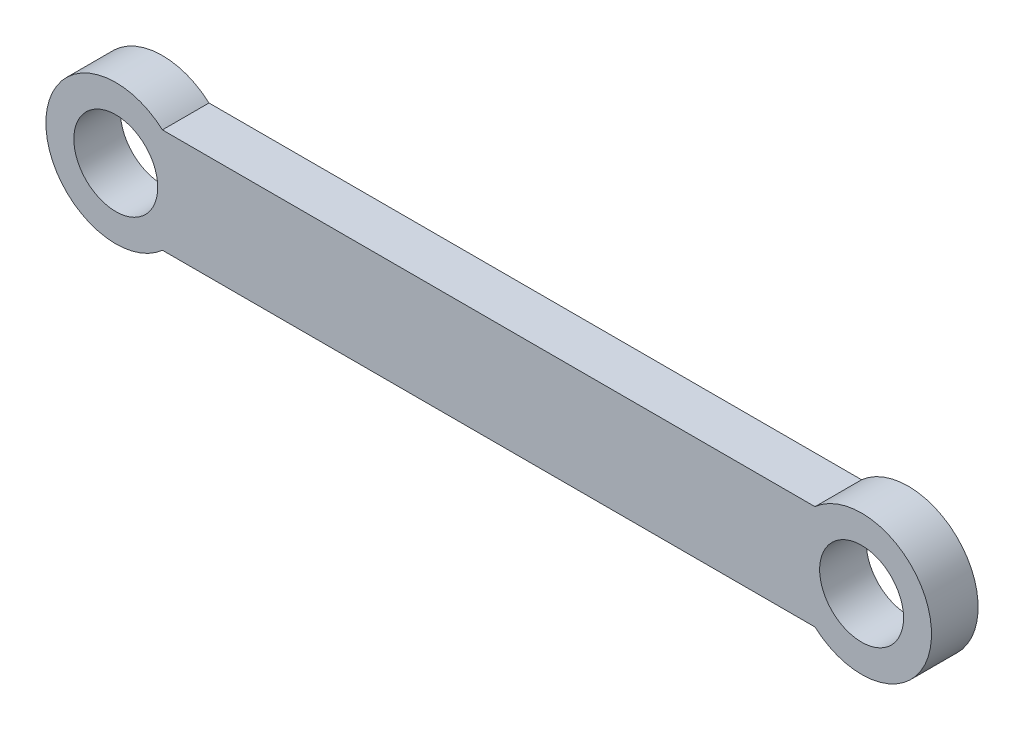
ISO-10303-21;
HEADER;
FILE_DESCRIPTION(('STEP AP214'),'2;1');
FILE_NAME('part.step','',(''),(''),'','','');
FILE_SCHEMA(('AUTOMOTIVE_DESIGN { 1 0 10303 214 1 1 1 1 }'));
ENDSEC;
DATA;
#1=APPLICATION_CONTEXT('core data for automotive mechanical design processes');
#2=APPLICATION_PROTOCOL_DEFINITION('international standard','automotive_design',2000,#1);
#3=PRODUCT_CONTEXT('',#1,'mechanical');
#4=PRODUCT('Part','Part','',(#3));
#5=PRODUCT_RELATED_PRODUCT_CATEGORY('part','',(#4));
#6=PRODUCT_DEFINITION_FORMATION('','',#4);
#7=PRODUCT_DEFINITION_CONTEXT('part definition',#1,'design');
#8=PRODUCT_DEFINITION('design','',#6,#7);
#9=PRODUCT_DEFINITION_SHAPE('','',#8);
#10=(LENGTH_UNIT() NAMED_UNIT(*) SI_UNIT(.MILLI.,.METRE.));
#11=(NAMED_UNIT(*) PLANE_ANGLE_UNIT() SI_UNIT($,.RADIAN.));
#12=(NAMED_UNIT(*) SI_UNIT($,.STERADIAN.) SOLID_ANGLE_UNIT());
#13=UNCERTAINTY_MEASURE_WITH_UNIT(LENGTH_MEASURE(1.E-05),#10,'distance_accuracy_value','');
#14=(GEOMETRIC_REPRESENTATION_CONTEXT(3) GLOBAL_UNCERTAINTY_ASSIGNED_CONTEXT((#13)) GLOBAL_UNIT_ASSIGNED_CONTEXT((#10,
#11,#12)) REPRESENTATION_CONTEXT('',''));
#15=CARTESIAN_POINT('',(0.,0.,0.));
#16=DIRECTION('',(0.,0.,1.));
#17=DIRECTION('',(1.,0.,0.));
#18=AXIS2_PLACEMENT_3D('',#15,#16,#17);
#19=CARTESIAN_POINT('',(0.,0.,5.));
#20=DIRECTION('',(0.,0.,1.));
#21=DIRECTION('',(1.,0.,0.));
#22=AXIS2_PLACEMENT_3D('',#19,#20,#21);
#23=PLANE('',#22);
#24=CARTESIAN_POINT('',(0.,0.,5.));
#25=DIRECTION('',(0.,0.,1.));
#26=DIRECTION('',(1.,0.,0.));
#27=AXIS2_PLACEMENT_3D('',#24,#25,#26);
#28=CIRCLE('',#27,4.5);
#29=CARTESIAN_POINT('',(4.5,0.,5.));
#30=VERTEX_POINT('',#29);
#31=EDGE_CURVE('E100',#30,#30,#28,.T.);
#32=ORIENTED_EDGE('',*,*,#31,.F.);
#33=EDGE_LOOP('',(#32));
#34=FACE_BOUND('',#33,.T.);
#35=CARTESIAN_POINT('',(0.,0.,5.));
#36=DIRECTION('',(0.,0.,1.));
#37=DIRECTION('',(1.,0.,0.));
#38=AXIS2_PLACEMENT_3D('',#35,#36,#37);
#39=CIRCLE('',#38,7.5);
#40=CARTESIAN_POINT('',(5.,5.59016994374947,5.));
#41=VERTEX_POINT('',#40);
#42=CARTESIAN_POINT('',(5.,-5.59016994374947,5.));
#43=VERTEX_POINT('',#42);
#44=EDGE_CURVE('E85',#41,#43,#39,.T.);
#45=ORIENTED_EDGE('',*,*,#44,.T.);
#46=DIRECTION('',(1.,0.,0.));
#47=VECTOR('',#46,1.);
#48=CARTESIAN_POINT('',(5.,-5.59016994374947,5.));
#49=LINE('',#48,#47);
#50=CARTESIAN_POINT('',(75.,-5.59016994374947,5.));
#51=VERTEX_POINT('',#50);
#52=EDGE_CURVE('E80',#43,#51,#49,.T.);
#53=ORIENTED_EDGE('',*,*,#52,.T.);
#54=CARTESIAN_POINT('',(80.,0.,5.));
#55=DIRECTION('',(0.,0.,1.));
#56=DIRECTION('',(1.,0.,0.));
#57=AXIS2_PLACEMENT_3D('',#54,#55,#56);
#58=CIRCLE('',#57,7.5);
#59=CARTESIAN_POINT('',(75.,5.59016994374947,5.));
#60=VERTEX_POINT('',#59);
#61=EDGE_CURVE('E83',#51,#60,#58,.T.);
#62=ORIENTED_EDGE('',*,*,#61,.T.);
#63=DIRECTION('',(-1.,0.,0.));
#64=VECTOR('',#63,1.);
#65=CARTESIAN_POINT('',(5.,5.59016994374947,5.));
#66=LINE('',#65,#64);
#67=EDGE_CURVE('E50',#60,#41,#66,.T.);
#68=ORIENTED_EDGE('',*,*,#67,.T.);
#69=EDGE_LOOP('',(#45,#53,#62,#68));
#70=FACE_BOUND('',#69,.T.);
#71=CARTESIAN_POINT('',(80.,0.,5.));
#72=DIRECTION('',(0.,0.,1.));
#73=DIRECTION('',(1.,0.,0.));
#74=AXIS2_PLACEMENT_3D('',#71,#72,#73);
#75=CIRCLE('',#74,4.5);
#76=CARTESIAN_POINT('',(84.5,0.,5.));
#77=VERTEX_POINT('',#76);
#78=EDGE_CURVE('E115',#77,#77,#75,.T.);
#79=ORIENTED_EDGE('',*,*,#78,.F.);
#80=EDGE_LOOP('',(#79));
#81=FACE_BOUND('',#80,.T.);
#82=ADVANCED_FACE('F33',(#34,#70,#81),#23,.T.);
#83=CARTESIAN_POINT('',(0.,0.,0.));
#84=DIRECTION('',(0.,0.,1.));
#85=DIRECTION('',(1.,0.,0.));
#86=AXIS2_PLACEMENT_3D('',#83,#84,#85);
#87=PLANE('',#86);
#88=CARTESIAN_POINT('',(0.,0.,0.));
#89=DIRECTION('',(0.,0.,1.));
#90=DIRECTION('',(1.,0.,0.));
#91=AXIS2_PLACEMENT_3D('',#88,#89,#90);
#92=CIRCLE('',#91,7.5);
#93=CARTESIAN_POINT('',(5.,5.59016994374947,0.));
#94=VERTEX_POINT('',#93);
#95=CARTESIAN_POINT('',(5.,-5.59016994374947,0.));
#96=VERTEX_POINT('',#95);
#97=EDGE_CURVE('E97',#94,#96,#92,.T.);
#98=ORIENTED_EDGE('',*,*,#97,.F.);
#99=DIRECTION('',(-1.,0.,0.));
#100=VECTOR('',#99,1.);
#101=CARTESIAN_POINT('',(5.,5.59016994374947,0.));
#102=LINE('',#101,#100);
#103=CARTESIAN_POINT('',(75.,5.59016994374947,0.));
#104=VERTEX_POINT('',#103);
#105=EDGE_CURVE('E73',#104,#94,#102,.T.);
#106=ORIENTED_EDGE('',*,*,#105,.F.);
#107=CARTESIAN_POINT('',(80.,0.,0.));
#108=DIRECTION('',(0.,0.,1.));
#109=DIRECTION('',(1.,0.,0.));
#110=AXIS2_PLACEMENT_3D('',#107,#108,#109);
#111=CIRCLE('',#110,7.5);
#112=CARTESIAN_POINT('',(75.,-5.59016994374947,0.));
#113=VERTEX_POINT('',#112);
#114=EDGE_CURVE('E67',#113,#104,#111,.T.);
#115=ORIENTED_EDGE('',*,*,#114,.F.);
#116=DIRECTION('',(1.,0.,0.));
#117=VECTOR('',#116,1.);
#118=CARTESIAN_POINT('',(5.,-5.59016994374947,0.));
#119=LINE('',#118,#117);
#120=EDGE_CURVE('E89',#96,#113,#119,.T.);
#121=ORIENTED_EDGE('',*,*,#120,.F.);
#122=EDGE_LOOP('',(#98,#106,#115,#121));
#123=FACE_BOUND('',#122,.T.);
#124=CARTESIAN_POINT('',(0.,0.,0.));
#125=DIRECTION('',(0.,0.,1.));
#126=DIRECTION('',(1.,0.,0.));
#127=AXIS2_PLACEMENT_3D('',#124,#125,#126);
#128=CIRCLE('',#127,4.5);
#129=CARTESIAN_POINT('',(4.5,0.,0.));
#130=VERTEX_POINT('',#129);
#131=EDGE_CURVE('E112',#130,#130,#128,.T.);
#132=ORIENTED_EDGE('',*,*,#131,.T.);
#133=EDGE_LOOP('',(#132));
#134=FACE_BOUND('',#133,.T.);
#135=CARTESIAN_POINT('',(80.,0.,0.));
#136=DIRECTION('',(0.,0.,1.));
#137=DIRECTION('',(1.,0.,0.));
#138=AXIS2_PLACEMENT_3D('',#135,#136,#137);
#139=CIRCLE('',#138,4.5);
#140=CARTESIAN_POINT('',(84.5,0.,0.));
#141=VERTEX_POINT('',#140);
#142=EDGE_CURVE('E118',#141,#141,#139,.T.);
#143=ORIENTED_EDGE('',*,*,#142,.T.);
#144=EDGE_LOOP('',(#143));
#145=FACE_BOUND('',#144,.T.);
#146=ADVANCED_FACE('F108',(#123,#134,#145),#87,.F.);
#147=CARTESIAN_POINT('',(0.,0.,5.));
#148=DIRECTION('',(0.,0.,-1.));
#149=DIRECTION('',(-1.,0.,0.));
#150=AXIS2_PLACEMENT_3D('',#147,#148,#149);
#151=CYLINDRICAL_SURFACE('',#150,7.5);
#152=ORIENTED_EDGE('',*,*,#97,.T.);
#153=DIRECTION('',(0.,0.,-1.));
#154=VECTOR('',#153,1.);
#155=CARTESIAN_POINT('',(5.,-5.59016994374947,5.));
#156=LINE('',#155,#154);
#157=EDGE_CURVE('E11',#43,#96,#156,.T.);
#158=ORIENTED_EDGE('',*,*,#157,.F.);
#159=ORIENTED_EDGE('',*,*,#44,.F.);
#160=DIRECTION('',(0.,0.,-1.));
#161=VECTOR('',#160,1.);
#162=CARTESIAN_POINT('',(5.,5.59016994374947,5.));
#163=LINE('',#162,#161);
#164=EDGE_CURVE('E93',#41,#94,#163,.T.);
#165=ORIENTED_EDGE('',*,*,#164,.T.);
#166=EDGE_LOOP('',(#152,#158,#159,#165));
#167=FACE_BOUND('',#166,.T.);
#168=ADVANCED_FACE('F35',(#167),#151,.T.);
#169=CARTESIAN_POINT('',(5.,-5.59016994374947,5.));
#170=DIRECTION('',(0.,1.,0.));
#171=DIRECTION('',(0.,0.,1.));
#172=AXIS2_PLACEMENT_3D('',#169,#170,#171);
#173=PLANE('',#172);
#174=ORIENTED_EDGE('',*,*,#120,.T.);
#175=DIRECTION('',(0.,0.,-1.));
#176=VECTOR('',#175,1.);
#177=CARTESIAN_POINT('',(75.,-5.59016994374947,5.));
#178=LINE('',#177,#176);
#179=EDGE_CURVE('E42',#51,#113,#178,.T.);
#180=ORIENTED_EDGE('',*,*,#179,.F.);
#181=ORIENTED_EDGE('',*,*,#52,.F.);
#182=ORIENTED_EDGE('',*,*,#157,.T.);
#183=EDGE_LOOP('',(#174,#180,#181,#182));
#184=FACE_BOUND('',#183,.T.);
#185=ADVANCED_FACE('F88',(#184),#173,.F.);
#186=CARTESIAN_POINT('',(80.,0.,5.));
#187=DIRECTION('',(0.,0.,-1.));
#188=DIRECTION('',(-1.,0.,0.));
#189=AXIS2_PLACEMENT_3D('',#186,#187,#188);
#190=CYLINDRICAL_SURFACE('',#189,7.5);
#191=ORIENTED_EDGE('',*,*,#114,.T.);
#192=DIRECTION('',(0.,0.,-1.));
#193=VECTOR('',#192,1.);
#194=CARTESIAN_POINT('',(75.,5.59016994374947,5.));
#195=LINE('',#194,#193);
#196=EDGE_CURVE('E90',#60,#104,#195,.T.);
#197=ORIENTED_EDGE('',*,*,#196,.F.);
#198=ORIENTED_EDGE('',*,*,#61,.F.);
#199=ORIENTED_EDGE('',*,*,#179,.T.);
#200=EDGE_LOOP('',(#191,#197,#198,#199));
#201=FACE_BOUND('',#200,.T.);
#202=ADVANCED_FACE('F91',(#201),#190,.T.);
#203=CARTESIAN_POINT('',(5.,5.59016994374947,5.));
#204=DIRECTION('',(0.,-1.,0.));
#205=DIRECTION('',(0.,0.,-1.));
#206=AXIS2_PLACEMENT_3D('',#203,#204,#205);
#207=PLANE('',#206);
#208=ORIENTED_EDGE('',*,*,#105,.T.);
#209=ORIENTED_EDGE('',*,*,#164,.F.);
#210=ORIENTED_EDGE('',*,*,#67,.F.);
#211=ORIENTED_EDGE('',*,*,#196,.T.);
#212=EDGE_LOOP('',(#208,#209,#210,#211));
#213=FACE_BOUND('',#212,.T.);
#214=ADVANCED_FACE('F105',(#213),#207,.F.);
#215=CARTESIAN_POINT('',(0.,0.,5.));
#216=DIRECTION('',(0.,0.,-1.));
#217=DIRECTION('',(-1.,0.,0.));
#218=AXIS2_PLACEMENT_3D('',#215,#216,#217);
#219=CYLINDRICAL_SURFACE('',#218,4.5);
#220=ORIENTED_EDGE('',*,*,#31,.T.);
#221=EDGE_LOOP('',(#220));
#222=FACE_BOUND('',#221,.T.);
#223=ORIENTED_EDGE('',*,*,#131,.F.);
#224=EDGE_LOOP('',(#223));
#225=FACE_BOUND('',#224,.T.);
#226=ADVANCED_FACE('F135',(#222,#225),#219,.F.);
#227=CARTESIAN_POINT('',(80.,0.,5.));
#228=DIRECTION('',(0.,0.,-1.));
#229=DIRECTION('',(-1.,0.,0.));
#230=AXIS2_PLACEMENT_3D('',#227,#228,#229);
#231=CYLINDRICAL_SURFACE('',#230,4.5);
#232=ORIENTED_EDGE('',*,*,#78,.T.);
#233=EDGE_LOOP('',(#232));
#234=FACE_BOUND('',#233,.T.);
#235=ORIENTED_EDGE('',*,*,#142,.F.);
#236=EDGE_LOOP('',(#235));
#237=FACE_BOUND('',#236,.T.);
#238=ADVANCED_FACE('F124',(#234,#237),#231,.F.);
#239=CLOSED_SHELL('',(#82,#146,#168,#185,#202,#214,#226,#238));
#240=MANIFOLD_SOLID_BREP('B2',#239);
#241=ADVANCED_BREP_SHAPE_REPRESENTATION('',(#18,#240),#14);
#242=SHAPE_DEFINITION_REPRESENTATION(#9,#241);
ENDSEC;
END-ISO-10303-21;
